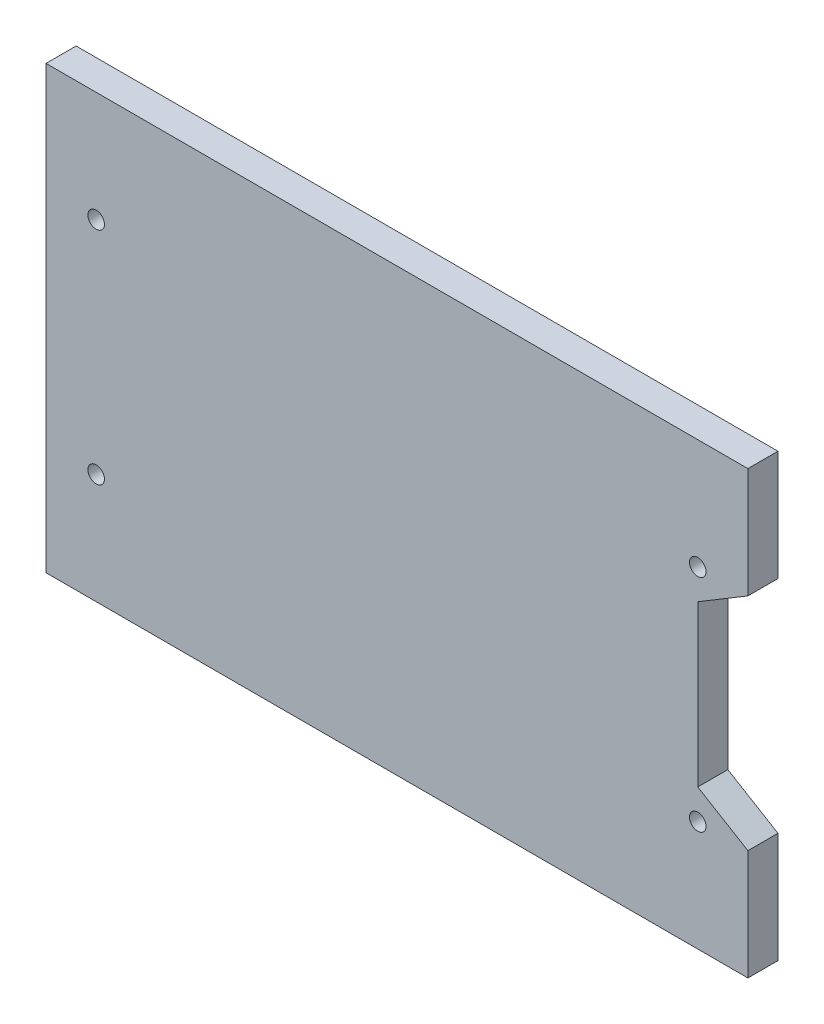
ISO-10303-21;
HEADER;
FILE_DESCRIPTION(('STEP AP214'),'2;1');
FILE_NAME('part.step','',(''),(''),'','','');
FILE_SCHEMA(('AUTOMOTIVE_DESIGN { 1 0 10303 214 1 1 1 1 }'));
ENDSEC;
DATA;
#1=APPLICATION_CONTEXT('core data for automotive mechanical design processes');
#2=APPLICATION_PROTOCOL_DEFINITION('international standard','automotive_design',2000,#1);
#3=PRODUCT_CONTEXT('',#1,'mechanical');
#4=PRODUCT('Part','Part','',(#3));
#5=PRODUCT_RELATED_PRODUCT_CATEGORY('part','',(#4));
#6=PRODUCT_DEFINITION_FORMATION('','',#4);
#7=PRODUCT_DEFINITION_CONTEXT('part definition',#1,'design');
#8=PRODUCT_DEFINITION('design','',#6,#7);
#9=PRODUCT_DEFINITION_SHAPE('','',#8);
#10=(LENGTH_UNIT() NAMED_UNIT(*) SI_UNIT(.MILLI.,.METRE.));
#11=(NAMED_UNIT(*) PLANE_ANGLE_UNIT() SI_UNIT($,.RADIAN.));
#12=(NAMED_UNIT(*) SI_UNIT($,.STERADIAN.) SOLID_ANGLE_UNIT());
#13=UNCERTAINTY_MEASURE_WITH_UNIT(LENGTH_MEASURE(1.E-05),#10,'distance_accuracy_value','');
#14=(GEOMETRIC_REPRESENTATION_CONTEXT(3) GLOBAL_UNCERTAINTY_ASSIGNED_CONTEXT((#13)) GLOBAL_UNIT_ASSIGNED_CONTEXT((#10,
#11,#12)) REPRESENTATION_CONTEXT('',''));
#15=CARTESIAN_POINT('',(0.,0.,0.));
#16=DIRECTION('',(0.,0.,1.));
#17=DIRECTION('',(1.,0.,0.));
#18=AXIS2_PLACEMENT_3D('',#15,#16,#17);
#19=CARTESIAN_POINT('',(0.,0.,6.));
#20=DIRECTION('',(0.,0.,1.));
#21=DIRECTION('',(1.,0.,0.));
#22=AXIS2_PLACEMENT_3D('',#19,#20,#21);
#23=PLANE('',#22);
#24=CARTESIAN_POINT('',(10.,22.,6.));
#25=DIRECTION('',(0.,0.,1.));
#26=DIRECTION('',(1.,0.,0.));
#27=AXIS2_PLACEMENT_3D('',#24,#25,#26);
#28=CIRCLE('',#27,1.65);
#29=CARTESIAN_POINT('',(11.65,22.,6.));
#30=VERTEX_POINT('',#29);
#31=EDGE_CURVE('E186',#30,#30,#28,.T.);
#32=ORIENTED_EDGE('',*,*,#31,.F.);
#33=EDGE_LOOP('',(#32));
#34=FACE_BOUND('',#33,.T.);
#35=CARTESIAN_POINT('',(130.,66.,6.));
#36=DIRECTION('',(0.,0.,1.));
#37=DIRECTION('',(-1.,0.,0.));
#38=AXIS2_PLACEMENT_3D('',#35,#36,#37);
#39=CIRCLE('',#38,1.65000000000002);
#40=CARTESIAN_POINT('',(128.35,66.,6.));
#41=VERTEX_POINT('',#40);
#42=EDGE_CURVE('E132',#41,#41,#39,.T.);
#43=ORIENTED_EDGE('',*,*,#42,.F.);
#44=EDGE_LOOP('',(#43));
#45=FACE_BOUND('',#44,.T.);
#46=DIRECTION('',(0.,-1.,0.));
#47=VECTOR('',#46,1.);
#48=CARTESIAN_POINT('',(0.,88.,6.));
#49=LINE('',#48,#47);
#50=CARTESIAN_POINT('',(0.,88.,6.));
#51=VERTEX_POINT('',#50);
#52=CARTESIAN_POINT('',(0.,0.,6.));
#53=VERTEX_POINT('',#52);
#54=EDGE_CURVE('E143',#51,#53,#49,.T.);
#55=ORIENTED_EDGE('',*,*,#54,.T.);
#56=DIRECTION('',(0.999999999999996,8.57143511673716E-08,0.));
#57=VECTOR('',#56,1.);
#58=CARTESIAN_POINT('',(0.,0.,6.));
#59=LINE('',#58,#57);
#60=CARTESIAN_POINT('',(140.,1.2000009163432E-05,6.));
#61=VERTEX_POINT('',#60);
#62=EDGE_CURVE('E91',#53,#61,#59,.T.);
#63=ORIENTED_EDGE('',*,*,#62,.T.);
#64=DIRECTION('',(-9.09090885903297E-07,0.999999999999587,0.));
#65=VECTOR('',#64,1.);
#66=CARTESIAN_POINT('',(140.,1.2000009163432E-05,6.));
#67=LINE('',#66,#65);
#68=CARTESIAN_POINT('',(139.99998,22.0000120000001,6.));
#69=VERTEX_POINT('',#68);
#70=EDGE_CURVE('E158',#61,#69,#67,.T.);
#71=ORIENTED_EDGE('',*,*,#70,.T.);
#72=DIRECTION('',(-0.857492925712547,0.514495755427522,0.));
#73=VECTOR('',#72,1.);
#74=CARTESIAN_POINT('',(130.,28.,6.));
#75=LINE('',#74,#73);
#76=CARTESIAN_POINT('',(130.,28.,6.));
#77=VERTEX_POINT('',#76);
#78=EDGE_CURVE('E171',#69,#77,#75,.T.);
#79=ORIENTED_EDGE('',*,*,#78,.T.);
#80=DIRECTION('',(0.,1.,0.));
#81=VECTOR('',#80,1.);
#82=CARTESIAN_POINT('',(130.,60.,6.));
#83=LINE('',#82,#81);
#84=CARTESIAN_POINT('',(130.,60.,6.));
#85=VERTEX_POINT('',#84);
#86=EDGE_CURVE('E110',#77,#85,#83,.T.);
#87=ORIENTED_EDGE('',*,*,#86,.T.);
#88=DIRECTION('',(0.857492925712547,0.514495755427522,0.));
#89=VECTOR('',#88,1.);
#90=CARTESIAN_POINT('',(130.,60.,6.));
#91=LINE('',#90,#89);
#92=CARTESIAN_POINT('',(139.99998,65.999988,6.));
#93=VERTEX_POINT('',#92);
#94=EDGE_CURVE('E104',#85,#93,#91,.T.);
#95=ORIENTED_EDGE('',*,*,#94,.T.);
#96=DIRECTION('',(9.09090885903297E-07,0.999999999999587,0.));
#97=VECTOR('',#96,1.);
#98=CARTESIAN_POINT('',(140.,87.9999879999909,6.));
#99=LINE('',#98,#97);
#100=CARTESIAN_POINT('',(140.,87.9999879999909,6.));
#101=VERTEX_POINT('',#100);
#102=EDGE_CURVE('E108',#93,#101,#99,.T.);
#103=ORIENTED_EDGE('',*,*,#102,.T.);
#104=DIRECTION('',(-0.999999999999996,8.57143509938992E-08,0.));
#105=VECTOR('',#104,1.);
#106=CARTESIAN_POINT('',(0.,88.,6.));
#107=LINE('',#106,#105);
#108=EDGE_CURVE('E48',#101,#51,#107,.T.);
#109=ORIENTED_EDGE('',*,*,#108,.T.);
#110=EDGE_LOOP('',(#55,#63,#71,#79,#87,#95,#103,#109));
#111=FACE_BOUND('',#110,.T.);
#112=CARTESIAN_POINT('',(10.,66.,6.));
#113=DIRECTION('',(0.,0.,1.));
#114=DIRECTION('',(-1.,0.,0.));
#115=AXIS2_PLACEMENT_3D('',#112,#113,#114);
#116=CIRCLE('',#115,1.65);
#117=CARTESIAN_POINT('',(8.35000000000001,66.,6.));
#118=VERTEX_POINT('',#117);
#119=EDGE_CURVE('E180',#118,#118,#116,.T.);
#120=ORIENTED_EDGE('',*,*,#119,.F.);
#121=EDGE_LOOP('',(#120));
#122=FACE_BOUND('',#121,.T.);
#123=CARTESIAN_POINT('',(130.,22.,6.));
#124=DIRECTION('',(0.,0.,1.));
#125=DIRECTION('',(1.,0.,0.));
#126=AXIS2_PLACEMENT_3D('',#123,#124,#125);
#127=CIRCLE('',#126,1.65000000000002);
#128=CARTESIAN_POINT('',(131.65,22.,6.));
#129=VERTEX_POINT('',#128);
#130=EDGE_CURVE('E192',#129,#129,#127,.T.);
#131=ORIENTED_EDGE('',*,*,#130,.F.);
#132=EDGE_LOOP('',(#131));
#133=FACE_BOUND('',#132,.T.);
#134=ADVANCED_FACE('F31',(#34,#45,#111,#122,#133),#23,.T.);
#135=CARTESIAN_POINT('',(0.,0.,0.));
#136=DIRECTION('',(0.,0.,1.));
#137=DIRECTION('',(1.,0.,0.));
#138=AXIS2_PLACEMENT_3D('',#135,#136,#137);
#139=PLANE('',#138);
#140=CARTESIAN_POINT('',(10.,22.,0.));
#141=DIRECTION('',(0.,0.,1.));
#142=DIRECTION('',(1.,0.,0.));
#143=AXIS2_PLACEMENT_3D('',#140,#141,#142);
#144=CIRCLE('',#143,1.65);
#145=CARTESIAN_POINT('',(11.65,22.,0.));
#146=VERTEX_POINT('',#145);
#147=EDGE_CURVE('E189',#146,#146,#144,.T.);
#148=ORIENTED_EDGE('',*,*,#147,.T.);
#149=EDGE_LOOP('',(#148));
#150=FACE_BOUND('',#149,.T.);
#151=CARTESIAN_POINT('',(130.,66.,0.));
#152=DIRECTION('',(0.,0.,1.));
#153=DIRECTION('',(-1.,0.,0.));
#154=AXIS2_PLACEMENT_3D('',#151,#152,#153);
#155=CIRCLE('',#154,1.65000000000002);
#156=CARTESIAN_POINT('',(128.35,66.,0.));
#157=VERTEX_POINT('',#156);
#158=EDGE_CURVE('E177',#157,#157,#155,.T.);
#159=ORIENTED_EDGE('',*,*,#158,.T.);
#160=EDGE_LOOP('',(#159));
#161=FACE_BOUND('',#160,.T.);
#162=DIRECTION('',(0.,-1.,0.));
#163=VECTOR('',#162,1.);
#164=CARTESIAN_POINT('',(0.,88.,0.));
#165=LINE('',#164,#163);
#166=CARTESIAN_POINT('',(0.,88.,0.));
#167=VERTEX_POINT('',#166);
#168=CARTESIAN_POINT('',(0.,0.,0.));
#169=VERTEX_POINT('',#168);
#170=EDGE_CURVE('E128',#167,#169,#165,.T.);
#171=ORIENTED_EDGE('',*,*,#170,.F.);
#172=DIRECTION('',(-0.999999999999996,8.57143509938992E-08,0.));
#173=VECTOR('',#172,1.);
#174=CARTESIAN_POINT('',(0.,88.,0.));
#175=LINE('',#174,#173);
#176=CARTESIAN_POINT('',(140.,87.9999879999909,0.));
#177=VERTEX_POINT('',#176);
#178=EDGE_CURVE('E83',#177,#167,#175,.T.);
#179=ORIENTED_EDGE('',*,*,#178,.F.);
#180=DIRECTION('',(9.09090885903297E-07,0.999999999999587,0.));
#181=VECTOR('',#180,1.);
#182=CARTESIAN_POINT('',(140.,87.9999879999909,0.));
#183=LINE('',#182,#181);
#184=CARTESIAN_POINT('',(139.99998,65.999988,0.));
#185=VERTEX_POINT('',#184);
#186=EDGE_CURVE('E77',#185,#177,#183,.T.);
#187=ORIENTED_EDGE('',*,*,#186,.F.);
#188=DIRECTION('',(0.857492925712547,0.514495755427522,0.));
#189=VECTOR('',#188,1.);
#190=CARTESIAN_POINT('',(130.,60.,0.));
#191=LINE('',#190,#189);
#192=CARTESIAN_POINT('',(130.,60.,0.));
#193=VERTEX_POINT('',#192);
#194=EDGE_CURVE('E118',#193,#185,#191,.T.);
#195=ORIENTED_EDGE('',*,*,#194,.F.);
#196=DIRECTION('',(0.,1.,0.));
#197=VECTOR('',#196,1.);
#198=CARTESIAN_POINT('',(130.,60.,0.));
#199=LINE('',#198,#197);
#200=CARTESIAN_POINT('',(130.,28.,0.));
#201=VERTEX_POINT('',#200);
#202=EDGE_CURVE('E138',#201,#193,#199,.T.);
#203=ORIENTED_EDGE('',*,*,#202,.F.);
#204=DIRECTION('',(-0.857492925712547,0.514495755427522,0.));
#205=VECTOR('',#204,1.);
#206=CARTESIAN_POINT('',(130.,28.,0.));
#207=LINE('',#206,#205);
#208=CARTESIAN_POINT('',(139.99998,22.0000120000001,0.));
#209=VERTEX_POINT('',#208);
#210=EDGE_CURVE('E136',#209,#201,#207,.T.);
#211=ORIENTED_EDGE('',*,*,#210,.F.);
#212=DIRECTION('',(-9.09090885903297E-07,0.999999999999587,0.));
#213=VECTOR('',#212,1.);
#214=CARTESIAN_POINT('',(140.,1.2000009163432E-05,0.));
#215=LINE('',#214,#213);
#216=CARTESIAN_POINT('',(140.,1.2000009163432E-05,0.));
#217=VERTEX_POINT('',#216);
#218=EDGE_CURVE('E134',#217,#209,#215,.T.);
#219=ORIENTED_EDGE('',*,*,#218,.F.);
#220=DIRECTION('',(0.999999999999996,8.57143511673716E-08,0.));
#221=VECTOR('',#220,1.);
#222=CARTESIAN_POINT('',(0.,0.,0.));
#223=LINE('',#222,#221);
#224=EDGE_CURVE('E131',#169,#217,#223,.T.);
#225=ORIENTED_EDGE('',*,*,#224,.F.);
#226=EDGE_LOOP('',(#171,#179,#187,#195,#203,#211,#219,#225));
#227=FACE_BOUND('',#226,.T.);
#228=CARTESIAN_POINT('',(10.,66.,0.));
#229=DIRECTION('',(0.,0.,1.));
#230=DIRECTION('',(-1.,0.,0.));
#231=AXIS2_PLACEMENT_3D('',#228,#229,#230);
#232=CIRCLE('',#231,1.65);
#233=CARTESIAN_POINT('',(8.35000000000001,66.,0.));
#234=VERTEX_POINT('',#233);
#235=EDGE_CURVE('E183',#234,#234,#232,.T.);
#236=ORIENTED_EDGE('',*,*,#235,.T.);
#237=EDGE_LOOP('',(#236));
#238=FACE_BOUND('',#237,.T.);
#239=CARTESIAN_POINT('',(130.,22.,0.));
#240=DIRECTION('',(0.,0.,1.));
#241=DIRECTION('',(1.,0.,0.));
#242=AXIS2_PLACEMENT_3D('',#239,#240,#241);
#243=CIRCLE('',#242,1.65000000000002);
#244=CARTESIAN_POINT('',(131.65,22.,0.));
#245=VERTEX_POINT('',#244);
#246=EDGE_CURVE('E195',#245,#245,#243,.T.);
#247=ORIENTED_EDGE('',*,*,#246,.T.);
#248=EDGE_LOOP('',(#247));
#249=FACE_BOUND('',#248,.T.);
#250=ADVANCED_FACE('F162',(#150,#161,#227,#238,#249),#139,.F.);
#251=CARTESIAN_POINT('',(0.,88.,6.));
#252=DIRECTION('',(1.,0.,0.));
#253=DIRECTION('',(0.,1.,0.));
#254=AXIS2_PLACEMENT_3D('',#251,#252,#253);
#255=PLANE('',#254);
#256=ORIENTED_EDGE('',*,*,#170,.T.);
#257=DIRECTION('',(0.,0.,-1.));
#258=VECTOR('',#257,1.);
#259=CARTESIAN_POINT('',(0.,0.,6.));
#260=LINE('',#259,#258);
#261=EDGE_CURVE('E11',#53,#169,#260,.T.);
#262=ORIENTED_EDGE('',*,*,#261,.F.);
#263=ORIENTED_EDGE('',*,*,#54,.F.);
#264=DIRECTION('',(0.,0.,-1.));
#265=VECTOR('',#264,1.);
#266=CARTESIAN_POINT('',(0.,88.,6.));
#267=LINE('',#266,#265);
#268=EDGE_CURVE('E124',#51,#167,#267,.T.);
#269=ORIENTED_EDGE('',*,*,#268,.T.);
#270=EDGE_LOOP('',(#256,#262,#263,#269));
#271=FACE_BOUND('',#270,.T.);
#272=ADVANCED_FACE('F33',(#271),#255,.F.);
#273=CARTESIAN_POINT('',(0.,0.,6.));
#274=DIRECTION('',(-8.57143511673716E-08,0.999999999999996,0.));
#275=DIRECTION('',(-0.999999999999996,-8.57143511673716E-08,0.));
#276=AXIS2_PLACEMENT_3D('',#273,#274,#275);
#277=PLANE('',#276);
#278=ORIENTED_EDGE('',*,*,#224,.T.);
#279=DIRECTION('',(0.,0.,-1.));
#280=VECTOR('',#279,1.);
#281=CARTESIAN_POINT('',(140.,1.2000009163432E-05,6.));
#282=LINE('',#281,#280);
#283=EDGE_CURVE('E40',#61,#217,#282,.T.);
#284=ORIENTED_EDGE('',*,*,#283,.F.);
#285=ORIENTED_EDGE('',*,*,#62,.F.);
#286=ORIENTED_EDGE('',*,*,#261,.T.);
#287=EDGE_LOOP('',(#278,#284,#285,#286));
#288=FACE_BOUND('',#287,.T.);
#289=ADVANCED_FACE('F230',(#288),#277,.F.);
#290=CARTESIAN_POINT('',(140.,1.2000009163432E-05,6.));
#291=DIRECTION('',(-0.999999999999587,-9.09090885903297E-07,0.));
#292=DIRECTION('',(9.09090885903297E-07,-0.999999999999587,0.));
#293=AXIS2_PLACEMENT_3D('',#290,#291,#292);
#294=PLANE('',#293);
#295=ORIENTED_EDGE('',*,*,#218,.T.);
#296=DIRECTION('',(0.,0.,-1.));
#297=VECTOR('',#296,1.);
#298=CARTESIAN_POINT('',(139.99998,22.0000120000001,6.));
#299=LINE('',#298,#297);
#300=EDGE_CURVE('E150',#69,#209,#299,.T.);
#301=ORIENTED_EDGE('',*,*,#300,.F.);
#302=ORIENTED_EDGE('',*,*,#70,.F.);
#303=ORIENTED_EDGE('',*,*,#283,.T.);
#304=EDGE_LOOP('',(#295,#301,#302,#303));
#305=FACE_BOUND('',#304,.T.);
#306=ADVANCED_FACE('F156',(#305),#294,.F.);
#307=CARTESIAN_POINT('',(130.,28.,6.));
#308=DIRECTION('',(-0.514495755427522,-0.857492925712547,0.));
#309=DIRECTION('',(0.857492925712547,-0.514495755427522,0.));
#310=AXIS2_PLACEMENT_3D('',#307,#308,#309);
#311=PLANE('',#310);
#312=ORIENTED_EDGE('',*,*,#210,.T.);
#313=DIRECTION('',(0.,0.,-1.));
#314=VECTOR('',#313,1.);
#315=CARTESIAN_POINT('',(130.,28.,6.));
#316=LINE('',#315,#314);
#317=EDGE_CURVE('E147',#77,#201,#316,.T.);
#318=ORIENTED_EDGE('',*,*,#317,.F.);
#319=ORIENTED_EDGE('',*,*,#78,.F.);
#320=ORIENTED_EDGE('',*,*,#300,.T.);
#321=EDGE_LOOP('',(#312,#318,#319,#320));
#322=FACE_BOUND('',#321,.T.);
#323=ADVANCED_FACE('F167',(#322),#311,.F.);
#324=CARTESIAN_POINT('',(130.,60.,6.));
#325=DIRECTION('',(-1.,0.,0.));
#326=DIRECTION('',(0.,0.,1.));
#327=AXIS2_PLACEMENT_3D('',#324,#325,#326);
#328=PLANE('',#327);
#329=ORIENTED_EDGE('',*,*,#202,.T.);
#330=DIRECTION('',(0.,0.,-1.));
#331=VECTOR('',#330,1.);
#332=CARTESIAN_POINT('',(130.,60.,6.));
#333=LINE('',#332,#331);
#334=EDGE_CURVE('E119',#85,#193,#333,.T.);
#335=ORIENTED_EDGE('',*,*,#334,.F.);
#336=ORIENTED_EDGE('',*,*,#86,.F.);
#337=ORIENTED_EDGE('',*,*,#317,.T.);
#338=EDGE_LOOP('',(#329,#335,#336,#337));
#339=FACE_BOUND('',#338,.T.);
#340=ADVANCED_FACE('F170',(#339),#328,.F.);
#341=CARTESIAN_POINT('',(130.,60.,6.));
#342=DIRECTION('',(-0.514495755427522,0.857492925712547,0.));
#343=DIRECTION('',(-0.857492925712547,-0.514495755427522,0.));
#344=AXIS2_PLACEMENT_3D('',#341,#342,#343);
#345=PLANE('',#344);
#346=ORIENTED_EDGE('',*,*,#194,.T.);
#347=DIRECTION('',(0.,0.,-1.));
#348=VECTOR('',#347,1.);
#349=CARTESIAN_POINT('',(139.99998,65.999988,6.));
#350=LINE('',#349,#348);
#351=EDGE_CURVE('E115',#93,#185,#350,.T.);
#352=ORIENTED_EDGE('',*,*,#351,.F.);
#353=ORIENTED_EDGE('',*,*,#94,.F.);
#354=ORIENTED_EDGE('',*,*,#334,.T.);
#355=EDGE_LOOP('',(#346,#352,#353,#354));
#356=FACE_BOUND('',#355,.T.);
#357=ADVANCED_FACE('F116',(#356),#345,.F.);
#358=CARTESIAN_POINT('',(140.,87.9999879999909,6.));
#359=DIRECTION('',(-0.999999999999587,9.09090885903297E-07,0.));
#360=DIRECTION('',(-9.09090885903297E-07,-0.999999999999587,0.));
#361=AXIS2_PLACEMENT_3D('',#358,#359,#360);
#362=PLANE('',#361);
#363=ORIENTED_EDGE('',*,*,#186,.T.);
#364=DIRECTION('',(0.,0.,-1.));
#365=VECTOR('',#364,1.);
#366=CARTESIAN_POINT('',(140.,87.9999879999909,6.));
#367=LINE('',#366,#365);
#368=EDGE_CURVE('E120',#101,#177,#367,.T.);
#369=ORIENTED_EDGE('',*,*,#368,.F.);
#370=ORIENTED_EDGE('',*,*,#102,.F.);
#371=ORIENTED_EDGE('',*,*,#351,.T.);
#372=EDGE_LOOP('',(#363,#369,#370,#371));
#373=FACE_BOUND('',#372,.T.);
#374=ADVANCED_FACE('F122',(#373),#362,.F.);
#375=CARTESIAN_POINT('',(0.,88.,6.));
#376=DIRECTION('',(-8.57143509938992E-08,-0.999999999999996,0.));
#377=DIRECTION('',(0.999999999999996,-8.57143509938992E-08,0.));
#378=AXIS2_PLACEMENT_3D('',#375,#376,#377);
#379=PLANE('',#378);
#380=ORIENTED_EDGE('',*,*,#178,.T.);
#381=ORIENTED_EDGE('',*,*,#268,.F.);
#382=ORIENTED_EDGE('',*,*,#108,.F.);
#383=ORIENTED_EDGE('',*,*,#368,.T.);
#384=EDGE_LOOP('',(#380,#381,#382,#383));
#385=FACE_BOUND('',#384,.T.);
#386=ADVANCED_FACE('F218',(#385),#379,.F.);
#387=CARTESIAN_POINT('',(130.,66.,6.));
#388=DIRECTION('',(0.,0.,-1.));
#389=DIRECTION('',(-1.,0.,0.));
#390=AXIS2_PLACEMENT_3D('',#387,#388,#389);
#391=CYLINDRICAL_SURFACE('',#390,1.65000000000002);
#392=ORIENTED_EDGE('',*,*,#42,.T.);
#393=EDGE_LOOP('',(#392));
#394=FACE_BOUND('',#393,.T.);
#395=ORIENTED_EDGE('',*,*,#158,.F.);
#396=EDGE_LOOP('',(#395));
#397=FACE_BOUND('',#396,.T.);
#398=ADVANCED_FACE('F215',(#394,#397),#391,.F.);
#399=CARTESIAN_POINT('',(10.,66.,6.));
#400=DIRECTION('',(0.,0.,-1.));
#401=DIRECTION('',(-1.,0.,0.));
#402=AXIS2_PLACEMENT_3D('',#399,#400,#401);
#403=CYLINDRICAL_SURFACE('',#402,1.65);
#404=ORIENTED_EDGE('',*,*,#119,.T.);
#405=EDGE_LOOP('',(#404));
#406=FACE_BOUND('',#405,.T.);
#407=ORIENTED_EDGE('',*,*,#235,.F.);
#408=EDGE_LOOP('',(#407));
#409=FACE_BOUND('',#408,.T.);
#410=ADVANCED_FACE('F294',(#406,#409),#403,.F.);
#411=CARTESIAN_POINT('',(10.,22.,6.));
#412=DIRECTION('',(0.,0.,-1.));
#413=DIRECTION('',(-1.,0.,0.));
#414=AXIS2_PLACEMENT_3D('',#411,#412,#413);
#415=CYLINDRICAL_SURFACE('',#414,1.65);
#416=ORIENTED_EDGE('',*,*,#31,.T.);
#417=EDGE_LOOP('',(#416));
#418=FACE_BOUND('',#417,.T.);
#419=ORIENTED_EDGE('',*,*,#147,.F.);
#420=EDGE_LOOP('',(#419));
#421=FACE_BOUND('',#420,.T.);
#422=ADVANCED_FACE('F302',(#418,#421),#415,.F.);
#423=CARTESIAN_POINT('',(130.,22.,6.));
#424=DIRECTION('',(0.,0.,-1.));
#425=DIRECTION('',(-1.,0.,0.));
#426=AXIS2_PLACEMENT_3D('',#423,#424,#425);
#427=CYLINDRICAL_SURFACE('',#426,1.65000000000002);
#428=ORIENTED_EDGE('',*,*,#130,.T.);
#429=EDGE_LOOP('',(#428));
#430=FACE_BOUND('',#429,.T.);
#431=ORIENTED_EDGE('',*,*,#246,.F.);
#432=EDGE_LOOP('',(#431));
#433=FACE_BOUND('',#432,.T.);
#434=ADVANCED_FACE('F201',(#430,#433),#427,.F.);
#435=CLOSED_SHELL('',(#134,#250,#272,#289,#306,#323,#340,#357,#374,#386,#398,#410,#422,#434));
#436=MANIFOLD_SOLID_BREP('B2',#435);
#437=ADVANCED_BREP_SHAPE_REPRESENTATION('',(#18,#436),#14);
#438=SHAPE_DEFINITION_REPRESENTATION(#9,#437);
ENDSEC;
END-ISO-10303-21;
